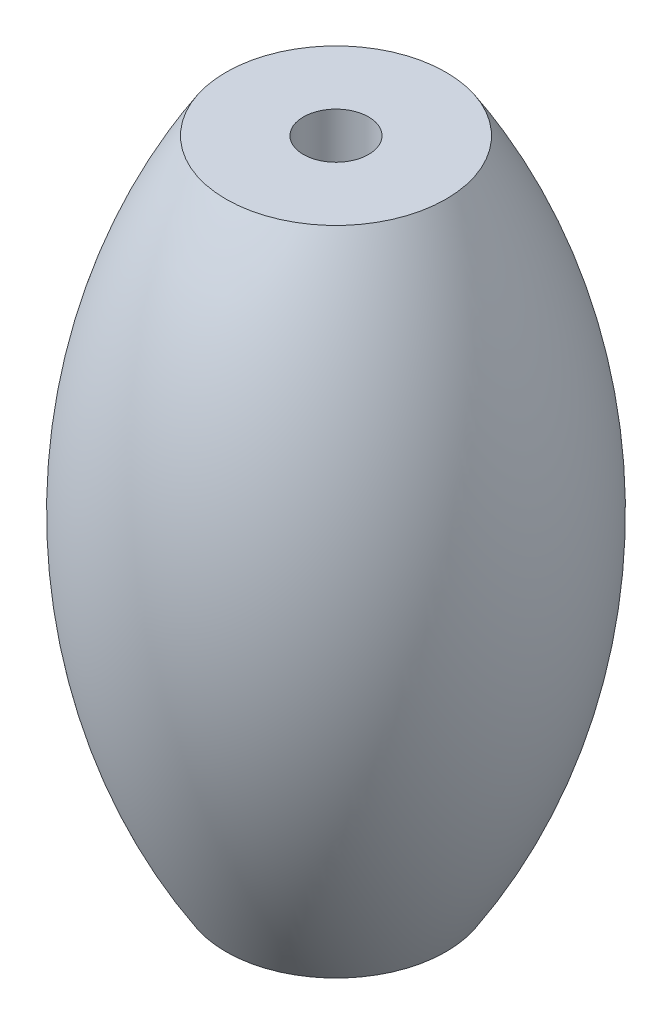
ISO-10303-21;
HEADER;
FILE_DESCRIPTION(('STEP AP214'),'2;1');
FILE_NAME('part.step','',(''),(''),'','','');
FILE_SCHEMA(('AUTOMOTIVE_DESIGN { 1 0 10303 214 1 1 1 1 }'));
ENDSEC;
DATA;
#1=APPLICATION_CONTEXT('core data for automotive mechanical design processes');
#2=APPLICATION_PROTOCOL_DEFINITION('international standard','automotive_design',2000,#1);
#3=PRODUCT_CONTEXT('',#1,'mechanical');
#4=PRODUCT('Part','Part','',(#3));
#5=PRODUCT_RELATED_PRODUCT_CATEGORY('part','',(#4));
#6=PRODUCT_DEFINITION_FORMATION('','',#4);
#7=PRODUCT_DEFINITION_CONTEXT('part definition',#1,'design');
#8=PRODUCT_DEFINITION('design','',#6,#7);
#9=PRODUCT_DEFINITION_SHAPE('','',#8);
#10=(LENGTH_UNIT() NAMED_UNIT(*) SI_UNIT(.MILLI.,.METRE.));
#11=(NAMED_UNIT(*) PLANE_ANGLE_UNIT() SI_UNIT($,.RADIAN.));
#12=(NAMED_UNIT(*) SI_UNIT($,.STERADIAN.) SOLID_ANGLE_UNIT());
#13=UNCERTAINTY_MEASURE_WITH_UNIT(LENGTH_MEASURE(1.E-05),#10,'distance_accuracy_value','');
#14=(GEOMETRIC_REPRESENTATION_CONTEXT(3) GLOBAL_UNCERTAINTY_ASSIGNED_CONTEXT((#13)) GLOBAL_UNIT_ASSIGNED_CONTEXT((#10,
#11,#12)) REPRESENTATION_CONTEXT('',''));
#15=CARTESIAN_POINT('',(0.,0.,0.));
#16=DIRECTION('',(0.,0.,1.));
#17=DIRECTION('',(1.,0.,0.));
#18=AXIS2_PLACEMENT_3D('',#15,#16,#17);
#19=CARTESIAN_POINT('',(0.,7.50000000000002,0.));
#20=DIRECTION('',(0.,1.,0.));
#21=DIRECTION('',(0.,0.,1.));
#22=AXIS2_PLACEMENT_3D('',#19,#20,#21);
#23=PLANE('',#22);
#24=CARTESIAN_POINT('',(0.,7.50000000000002,0.));
#25=DIRECTION('',(0.,-1.,0.));
#26=DIRECTION('',(0.,0.,-1.));
#27=AXIS2_PLACEMENT_3D('',#24,#25,#26);
#28=CIRCLE('',#27,0.749999999999999);
#29=CARTESIAN_POINT('',(0.,7.50000000000002,-0.749999999999999));
#30=VERTEX_POINT('',#29);
#31=EDGE_CURVE('E44',#30,#30,#28,.T.);
#32=ORIENTED_EDGE('',*,*,#31,.T.);
#33=EDGE_LOOP('',(#32));
#34=FACE_BOUND('',#33,.T.);
#35=CARTESIAN_POINT('',(0.,7.50000000000002,0.));
#36=DIRECTION('',(0.,-1.,0.));
#37=DIRECTION('',(0.,0.,-1.));
#38=AXIS2_PLACEMENT_3D('',#35,#36,#37);
#39=CIRCLE('',#38,2.53120936077031);
#40=CARTESIAN_POINT('',(0.,7.50000000000002,-2.53120936077031));
#41=VERTEX_POINT('',#40);
#42=EDGE_CURVE('E10',#41,#41,#39,.T.);
#43=ORIENTED_EDGE('',*,*,#42,.F.);
#44=EDGE_LOOP('',(#43));
#45=FACE_BOUND('',#44,.T.);
#46=ADVANCED_FACE('F30',(#34,#45),#23,.T.);
#47=CARTESIAN_POINT('',(0.,0.,0.));
#48=DIRECTION('',(0.,-1.,0.));
#49=DIRECTION('',(0.,0.,-1.));
#50=AXIS2_PLACEMENT_3D('',#47,#48,#49);
#51=DEGENERATE_TOROIDAL_SURFACE('',#50,9.29038105676657,14.,.F.);
#52=CARTESIAN_POINT('',(0.,-7.50000000000002,0.));
#53=DIRECTION('',(0.,-1.,0.));
#54=DIRECTION('',(0.,0.,-1.));
#55=AXIS2_PLACEMENT_3D('',#52,#53,#54);
#56=CIRCLE('',#55,2.53120936077031);
#57=CARTESIAN_POINT('',(0.,-7.50000000000002,-2.53120936077031));
#58=VERTEX_POINT('',#57);
#59=EDGE_CURVE('E36',#58,#58,#56,.T.);
#60=ORIENTED_EDGE('',*,*,#59,.F.);
#61=EDGE_LOOP('',(#60));
#62=FACE_BOUND('',#61,.T.);
#63=ORIENTED_EDGE('',*,*,#42,.T.);
#64=EDGE_LOOP('',(#63));
#65=FACE_BOUND('',#64,.T.);
#66=ADVANCED_FACE('F60',(#62,#65),#51,.F.);
#67=CARTESIAN_POINT('',(0.,-7.50000000000002,0.));
#68=DIRECTION('',(0.,1.,0.));
#69=DIRECTION('',(0.,0.,1.));
#70=AXIS2_PLACEMENT_3D('',#67,#68,#69);
#71=PLANE('',#70);
#72=CARTESIAN_POINT('',(0.,-7.50000000000002,0.));
#73=DIRECTION('',(0.,-1.,0.));
#74=DIRECTION('',(0.,0.,-1.));
#75=AXIS2_PLACEMENT_3D('',#72,#73,#74);
#76=CIRCLE('',#75,0.749999999999999);
#77=CARTESIAN_POINT('',(0.,-7.50000000000002,-0.749999999999999));
#78=VERTEX_POINT('',#77);
#79=EDGE_CURVE('E40',#78,#78,#76,.T.);
#80=ORIENTED_EDGE('',*,*,#79,.F.);
#81=EDGE_LOOP('',(#80));
#82=FACE_BOUND('',#81,.T.);
#83=ORIENTED_EDGE('',*,*,#59,.T.);
#84=EDGE_LOOP('',(#83));
#85=FACE_BOUND('',#84,.T.);
#86=ADVANCED_FACE('F54',(#82,#85),#71,.F.);
#87=CARTESIAN_POINT('',(0.,-10.7217935159866,0.));
#88=DIRECTION('',(0.,-1.,0.));
#89=DIRECTION('',(0.,0.,-1.));
#90=AXIS2_PLACEMENT_3D('',#87,#88,#89);
#91=CYLINDRICAL_SURFACE('',#90,0.749999999999999);
#92=ORIENTED_EDGE('',*,*,#79,.T.);
#93=EDGE_LOOP('',(#92));
#94=FACE_BOUND('',#93,.T.);
#95=ORIENTED_EDGE('',*,*,#31,.F.);
#96=EDGE_LOOP('',(#95));
#97=FACE_BOUND('',#96,.T.);
#98=ADVANCED_FACE('F52',(#94,#97),#91,.F.);
#99=CLOSED_SHELL('',(#46,#66,#86,#98));
#100=MANIFOLD_SOLID_BREP('B2',#99);
#101=ADVANCED_BREP_SHAPE_REPRESENTATION('',(#18,#100),#14);
#102=SHAPE_DEFINITION_REPRESENTATION(#9,#101);
ENDSEC;
END-ISO-10303-21;
